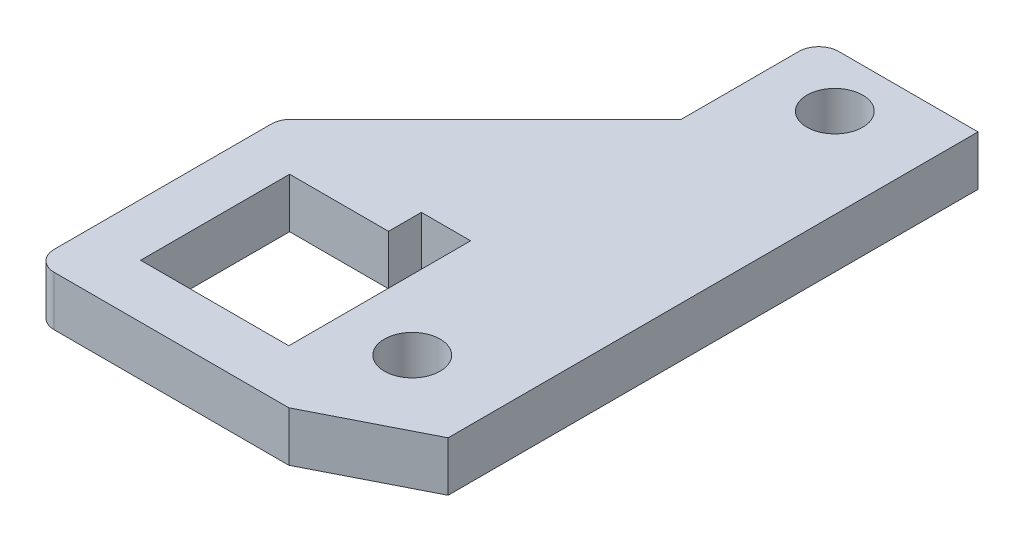
ISO-10303-21;
HEADER;
FILE_DESCRIPTION(('STEP AP214'),'2;1');
FILE_NAME('part.step','',(''),(''),'','','');
FILE_SCHEMA(('AUTOMOTIVE_DESIGN { 1 0 10303 214 1 1 1 1 }'));
ENDSEC;
DATA;
#1=APPLICATION_CONTEXT('core data for automotive mechanical design processes');
#2=APPLICATION_PROTOCOL_DEFINITION('international standard','automotive_design',2000,#1);
#3=PRODUCT_CONTEXT('',#1,'mechanical');
#4=PRODUCT('Part','Part','',(#3));
#5=PRODUCT_RELATED_PRODUCT_CATEGORY('part','',(#4));
#6=PRODUCT_DEFINITION_FORMATION('','',#4);
#7=PRODUCT_DEFINITION_CONTEXT('part definition',#1,'design');
#8=PRODUCT_DEFINITION('design','',#6,#7);
#9=PRODUCT_DEFINITION_SHAPE('','',#8);
#10=(LENGTH_UNIT() NAMED_UNIT(*) SI_UNIT(.MILLI.,.METRE.));
#11=(NAMED_UNIT(*) PLANE_ANGLE_UNIT() SI_UNIT($,.RADIAN.));
#12=(NAMED_UNIT(*) SI_UNIT($,.STERADIAN.) SOLID_ANGLE_UNIT());
#13=UNCERTAINTY_MEASURE_WITH_UNIT(LENGTH_MEASURE(1.E-05),#10,'distance_accuracy_value','');
#14=(GEOMETRIC_REPRESENTATION_CONTEXT(3) GLOBAL_UNCERTAINTY_ASSIGNED_CONTEXT((#13)) GLOBAL_UNIT_ASSIGNED_CONTEXT((#10,
#11,#12)) REPRESENTATION_CONTEXT('',''));
#15=CARTESIAN_POINT('',(0.,0.,0.));
#16=DIRECTION('',(0.,0.,1.));
#17=DIRECTION('',(1.,0.,0.));
#18=AXIS2_PLACEMENT_3D('',#15,#16,#17);
#19=CARTESIAN_POINT('',(1.27,3.175,-1.27));
#20=DIRECTION('',(0.,-1.,0.));
#21=DIRECTION('',(0.,0.,-1.));
#22=AXIS2_PLACEMENT_3D('',#19,#20,#21);
#23=CYLINDRICAL_SURFACE('',#22,1.27);
#24=CARTESIAN_POINT('',(1.27,0.,-1.27));
#25=DIRECTION('',(0.,-1.,0.));
#26=DIRECTION('',(0.,0.,-1.));
#27=AXIS2_PLACEMENT_3D('',#24,#25,#26);
#28=CIRCLE('',#27,1.27);
#29=CARTESIAN_POINT('',(1.27,0.,0.));
#30=VERTEX_POINT('',#29);
#31=CARTESIAN_POINT('',(0.,0.,-1.27));
#32=VERTEX_POINT('',#31);
#33=EDGE_CURVE('E194',#30,#32,#28,.T.);
#34=ORIENTED_EDGE('',*,*,#33,.F.);
#35=DIRECTION('',(0.,-1.,0.));
#36=VECTOR('',#35,1.);
#37=CARTESIAN_POINT('',(1.27,3.175,0.));
#38=LINE('',#37,#36);
#39=CARTESIAN_POINT('',(1.27,3.175,0.));
#40=VERTEX_POINT('',#39);
#41=EDGE_CURVE('E11',#40,#30,#38,.T.);
#42=ORIENTED_EDGE('',*,*,#41,.F.);
#43=CARTESIAN_POINT('',(1.27,3.175,-1.27));
#44=DIRECTION('',(0.,-1.,0.));
#45=DIRECTION('',(0.,0.,-1.));
#46=AXIS2_PLACEMENT_3D('',#43,#44,#45);
#47=CIRCLE('',#46,1.27);
#48=CARTESIAN_POINT('',(0.,3.175,-1.27));
#49=VERTEX_POINT('',#48);
#50=EDGE_CURVE('E202',#40,#49,#47,.T.);
#51=ORIENTED_EDGE('',*,*,#50,.T.);
#52=DIRECTION('',(0.,-1.,0.));
#53=VECTOR('',#52,1.);
#54=CARTESIAN_POINT('',(0.,3.175,-1.27));
#55=LINE('',#54,#53);
#56=EDGE_CURVE('E35',#49,#32,#55,.T.);
#57=ORIENTED_EDGE('',*,*,#56,.T.);
#58=EDGE_LOOP('',(#34,#42,#51,#57));
#59=FACE_BOUND('',#58,.T.);
#60=ADVANCED_FACE('F32',(#59),#23,.T.);
#61=CARTESIAN_POINT('',(16.2239556670893,3.175,0.));
#62=DIRECTION('',(0.,0.,1.));
#63=DIRECTION('',(1.,0.,0.));
#64=AXIS2_PLACEMENT_3D('',#61,#62,#63);
#65=PLANE('',#64);
#66=DIRECTION('',(-1.,0.,0.));
#67=VECTOR('',#66,1.);
#68=CARTESIAN_POINT('',(16.2239556670893,0.,0.));
#69=LINE('',#68,#67);
#70=CARTESIAN_POINT('',(16.2239556670893,0.,0.));
#71=VERTEX_POINT('',#70);
#72=EDGE_CURVE('E206',#71,#30,#69,.T.);
#73=ORIENTED_EDGE('',*,*,#72,.F.);
#74=DIRECTION('',(0.,-1.,0.));
#75=VECTOR('',#74,1.);
#76=CARTESIAN_POINT('',(16.2239556670893,3.175,0.));
#77=LINE('',#76,#75);
#78=CARTESIAN_POINT('',(16.2239556670893,3.175,0.));
#79=VERTEX_POINT('',#78);
#80=EDGE_CURVE('E40',#79,#71,#77,.T.);
#81=ORIENTED_EDGE('',*,*,#80,.F.);
#82=DIRECTION('',(-1.,0.,0.));
#83=VECTOR('',#82,1.);
#84=CARTESIAN_POINT('',(16.2239556670893,3.175,0.));
#85=LINE('',#84,#83);
#86=EDGE_CURVE('E230',#79,#40,#85,.T.);
#87=ORIENTED_EDGE('',*,*,#86,.T.);
#88=ORIENTED_EDGE('',*,*,#41,.T.);
#89=EDGE_LOOP('',(#73,#81,#87,#88));
#90=FACE_BOUND('',#89,.T.);
#91=ADVANCED_FACE('F287',(#90),#65,.T.);
#92=CARTESIAN_POINT('',(22.9633593823173,3.175,-3.42057377293219));
#93=DIRECTION('',(0.452590350451546,0.,0.891718551269483));
#94=DIRECTION('',(0.891718551269483,0.,-0.452590350451546));
#95=AXIS2_PLACEMENT_3D('',#92,#93,#94);
#96=PLANE('',#95);
#97=DIRECTION('',(-0.891718551269483,0.,0.452590350451546));
#98=VECTOR('',#97,1.);
#99=CARTESIAN_POINT('',(22.9633593823173,0.,-3.42057377293219));
#100=LINE('',#99,#98);
#101=CARTESIAN_POINT('',(22.9633593823173,0.,-3.42057377293219));
#102=VERTEX_POINT('',#101);
#103=EDGE_CURVE('E256',#102,#71,#100,.T.);
#104=ORIENTED_EDGE('',*,*,#103,.F.);
#105=DIRECTION('',(0.,-1.,0.));
#106=VECTOR('',#105,1.);
#107=CARTESIAN_POINT('',(22.9633593823173,3.175,-3.42057377293219));
#108=LINE('',#107,#106);
#109=CARTESIAN_POINT('',(22.9633593823173,3.175,-3.42057377293219));
#110=VERTEX_POINT('',#109);
#111=EDGE_CURVE('E262',#110,#102,#108,.T.);
#112=ORIENTED_EDGE('',*,*,#111,.F.);
#113=DIRECTION('',(-0.891718551269483,0.,0.452590350451546));
#114=VECTOR('',#113,1.);
#115=CARTESIAN_POINT('',(22.9633593823173,3.175,-3.42057377293219));
#116=LINE('',#115,#114);
#117=EDGE_CURVE('E227',#110,#79,#116,.T.);
#118=ORIENTED_EDGE('',*,*,#117,.T.);
#119=ORIENTED_EDGE('',*,*,#80,.T.);
#120=EDGE_LOOP('',(#104,#112,#118,#119));
#121=FACE_BOUND('',#120,.T.);
#122=ADVANCED_FACE('F314',(#121),#96,.T.);
#123=CARTESIAN_POINT('',(22.9633593823173,3.175,-37.2025926));
#124=DIRECTION('',(1.,0.,0.));
#125=DIRECTION('',(0.,0.,-1.));
#126=AXIS2_PLACEMENT_3D('',#123,#124,#125);
#127=PLANE('',#126);
#128=DIRECTION('',(0.,0.,1.));
#129=VECTOR('',#128,1.);
#130=CARTESIAN_POINT('',(22.9633593823173,0.,-37.2025926));
#131=LINE('',#130,#129);
#132=CARTESIAN_POINT('',(22.9633593823173,0.,-37.2025926));
#133=VERTEX_POINT('',#132);
#134=EDGE_CURVE('E253',#133,#102,#131,.T.);
#135=ORIENTED_EDGE('',*,*,#134,.F.);
#136=DIRECTION('',(0.,-1.,0.));
#137=VECTOR('',#136,1.);
#138=CARTESIAN_POINT('',(22.9633593823173,3.175,-37.2025926));
#139=LINE('',#138,#137);
#140=CARTESIAN_POINT('',(22.9633593823173,3.175,-37.2025926));
#141=VERTEX_POINT('',#140);
#142=EDGE_CURVE('E264',#141,#133,#139,.T.);
#143=ORIENTED_EDGE('',*,*,#142,.F.);
#144=DIRECTION('',(0.,0.,1.));
#145=VECTOR('',#144,1.);
#146=CARTESIAN_POINT('',(22.9633593823173,3.175,-37.2025926));
#147=LINE('',#146,#145);
#148=EDGE_CURVE('E224',#141,#110,#147,.T.);
#149=ORIENTED_EDGE('',*,*,#148,.T.);
#150=ORIENTED_EDGE('',*,*,#111,.T.);
#151=EDGE_LOOP('',(#135,#143,#149,#150));
#152=FACE_BOUND('',#151,.T.);
#153=ADVANCED_FACE('F312',(#152),#127,.T.);
#154=CARTESIAN_POINT('',(14.0812333823173,3.175,-37.2025926));
#155=DIRECTION('',(0.,0.,-1.));
#156=DIRECTION('',(-1.,0.,0.));
#157=AXIS2_PLACEMENT_3D('',#154,#155,#156);
#158=PLANE('',#157);
#159=DIRECTION('',(1.,0.,0.));
#160=VECTOR('',#159,1.);
#161=CARTESIAN_POINT('',(14.0812333823173,0.,-37.2025926));
#162=LINE('',#161,#160);
#163=CARTESIAN_POINT('',(14.0812333823173,0.,-37.2025926));
#164=VERTEX_POINT('',#163);
#165=EDGE_CURVE('E250',#164,#133,#162,.T.);
#166=ORIENTED_EDGE('',*,*,#165,.F.);
#167=DIRECTION('',(0.,-1.,0.));
#168=VECTOR('',#167,1.);
#169=CARTESIAN_POINT('',(14.0812333823173,3.175,-37.2025926));
#170=LINE('',#169,#168);
#171=CARTESIAN_POINT('',(14.0812333823173,3.175,-37.2025926));
#172=VERTEX_POINT('',#171);
#173=EDGE_CURVE('E266',#172,#164,#170,.T.);
#174=ORIENTED_EDGE('',*,*,#173,.F.);
#175=DIRECTION('',(1.,0.,0.));
#176=VECTOR('',#175,1.);
#177=CARTESIAN_POINT('',(14.0812333823173,3.175,-37.2025926));
#178=LINE('',#177,#176);
#179=EDGE_CURVE('E221',#172,#141,#178,.T.);
#180=ORIENTED_EDGE('',*,*,#179,.T.);
#181=ORIENTED_EDGE('',*,*,#142,.T.);
#182=EDGE_LOOP('',(#166,#174,#180,#181));
#183=FACE_BOUND('',#182,.T.);
#184=ADVANCED_FACE('F308',(#183),#158,.T.);
#185=CARTESIAN_POINT('',(14.0812333823173,3.175,-35.9325926));
#186=DIRECTION('',(0.,-1.,0.));
#187=DIRECTION('',(0.,0.,-1.));
#188=AXIS2_PLACEMENT_3D('',#185,#186,#187);
#189=CYLINDRICAL_SURFACE('',#188,1.27);
#190=CARTESIAN_POINT('',(14.0812333823173,0.,-35.9325926));
#191=DIRECTION('',(0.,-1.,0.));
#192=DIRECTION('',(0.,0.,-1.));
#193=AXIS2_PLACEMENT_3D('',#190,#191,#192);
#194=CIRCLE('',#193,1.27);
#195=CARTESIAN_POINT('',(12.8112333823173,0.,-35.9325926));
#196=VERTEX_POINT('',#195);
#197=EDGE_CURVE('E247',#196,#164,#194,.T.);
#198=ORIENTED_EDGE('',*,*,#197,.F.);
#199=DIRECTION('',(0.,-1.,0.));
#200=VECTOR('',#199,1.);
#201=CARTESIAN_POINT('',(12.8112333823173,3.175,-35.9325926));
#202=LINE('',#201,#200);
#203=CARTESIAN_POINT('',(12.8112333823173,3.175,-35.9325926));
#204=VERTEX_POINT('',#203);
#205=EDGE_CURVE('E268',#204,#196,#202,.T.);
#206=ORIENTED_EDGE('',*,*,#205,.F.);
#207=CARTESIAN_POINT('',(14.0812333823173,3.175,-35.9325926));
#208=DIRECTION('',(0.,-1.,0.));
#209=DIRECTION('',(0.,0.,-1.));
#210=AXIS2_PLACEMENT_3D('',#207,#208,#209);
#211=CIRCLE('',#210,1.27);
#212=EDGE_CURVE('E218',#204,#172,#211,.T.);
#213=ORIENTED_EDGE('',*,*,#212,.T.);
#214=ORIENTED_EDGE('',*,*,#173,.T.);
#215=EDGE_LOOP('',(#198,#206,#213,#214));
#216=FACE_BOUND('',#215,.T.);
#217=ADVANCED_FACE('F304',(#216),#189,.T.);
#218=CARTESIAN_POINT('',(12.8112333823173,3.175,-28.4334966));
#219=DIRECTION('',(-1.,0.,0.));
#220=DIRECTION('',(0.,0.,1.));
#221=AXIS2_PLACEMENT_3D('',#218,#219,#220);
#222=PLANE('',#221);
#223=DIRECTION('',(0.,0.,-1.));
#224=VECTOR('',#223,1.);
#225=CARTESIAN_POINT('',(12.8112333823173,0.,-28.4334966));
#226=LINE('',#225,#224);
#227=CARTESIAN_POINT('',(12.8112333823173,0.,-28.4334966));
#228=VERTEX_POINT('',#227);
#229=EDGE_CURVE('E244',#228,#196,#226,.T.);
#230=ORIENTED_EDGE('',*,*,#229,.F.);
#231=DIRECTION('',(0.,-1.,0.));
#232=VECTOR('',#231,1.);
#233=CARTESIAN_POINT('',(12.8112333823173,3.175,-28.4334966));
#234=LINE('',#233,#232);
#235=CARTESIAN_POINT('',(12.8112333823173,3.175,-28.4334966));
#236=VERTEX_POINT('',#235);
#237=EDGE_CURVE('E270',#236,#228,#234,.T.);
#238=ORIENTED_EDGE('',*,*,#237,.F.);
#239=DIRECTION('',(0.,0.,-1.));
#240=VECTOR('',#239,1.);
#241=CARTESIAN_POINT('',(12.8112333823173,3.175,-28.4334966));
#242=LINE('',#241,#240);
#243=EDGE_CURVE('E215',#236,#204,#242,.T.);
#244=ORIENTED_EDGE('',*,*,#243,.T.);
#245=ORIENTED_EDGE('',*,*,#205,.T.);
#246=EDGE_LOOP('',(#230,#238,#244,#245));
#247=FACE_BOUND('',#246,.T.);
#248=ADVANCED_FACE('F300',(#247),#222,.T.);
#249=CARTESIAN_POINT('',(0.371974387893079,3.175,-15.9942376055759));
#250=DIRECTION('',(-0.707106781186546,0.,-0.707106781186549));
#251=DIRECTION('',(-0.707106781186549,0.,0.707106781186546));
#252=AXIS2_PLACEMENT_3D('',#249,#250,#251);
#253=PLANE('',#252);
#254=DIRECTION('',(0.707106781186549,0.,-0.707106781186546));
#255=VECTOR('',#254,1.);
#256=CARTESIAN_POINT('',(0.371974387893079,0.,-15.9942376055759));
#257=LINE('',#256,#255);
#258=CARTESIAN_POINT('',(0.371974387893079,0.,-15.9942376055759));
#259=VERTEX_POINT('',#258);
#260=EDGE_CURVE('E241',#259,#228,#257,.T.);
#261=ORIENTED_EDGE('',*,*,#260,.F.);
#262=DIRECTION('',(0.,-1.,0.));
#263=VECTOR('',#262,1.);
#264=CARTESIAN_POINT('',(0.371974387893079,3.175,-15.9942376055759));
#265=LINE('',#264,#263);
#266=CARTESIAN_POINT('',(0.371974387893079,3.175,-15.9942376055759));
#267=VERTEX_POINT('',#266);
#268=EDGE_CURVE('E272',#267,#259,#265,.T.);
#269=ORIENTED_EDGE('',*,*,#268,.F.);
#270=DIRECTION('',(0.707106781186549,0.,-0.707106781186546));
#271=VECTOR('',#270,1.);
#272=CARTESIAN_POINT('',(0.371974387893079,3.175,-15.9942376055759));
#273=LINE('',#272,#271);
#274=EDGE_CURVE('E212',#267,#236,#273,.T.);
#275=ORIENTED_EDGE('',*,*,#274,.T.);
#276=ORIENTED_EDGE('',*,*,#237,.T.);
#277=EDGE_LOOP('',(#261,#269,#275,#276));
#278=FACE_BOUND('',#277,.T.);
#279=ADVANCED_FACE('F298',(#278),#253,.T.);
#280=CARTESIAN_POINT('',(1.26999999999999,3.175,-15.096211993469));
#281=DIRECTION('',(0.,-1.,0.));
#282=DIRECTION('',(0.,0.,-1.));
#283=AXIS2_PLACEMENT_3D('',#280,#281,#282);
#284=CYLINDRICAL_SURFACE('',#283,1.27);
#285=CARTESIAN_POINT('',(1.26999999999999,0.,-15.096211993469));
#286=DIRECTION('',(0.,-1.,0.));
#287=DIRECTION('',(0.,0.,-1.));
#288=AXIS2_PLACEMENT_3D('',#285,#286,#287);
#289=CIRCLE('',#288,1.27);
#290=CARTESIAN_POINT('',(0.,0.,-15.096211993469));
#291=VERTEX_POINT('',#290);
#292=EDGE_CURVE('E238',#291,#259,#289,.T.);
#293=ORIENTED_EDGE('',*,*,#292,.F.);
#294=DIRECTION('',(0.,-1.,0.));
#295=VECTOR('',#294,1.);
#296=CARTESIAN_POINT('',(0.,3.175,-15.096211993469));
#297=LINE('',#296,#295);
#298=CARTESIAN_POINT('',(0.,3.175,-15.096211993469));
#299=VERTEX_POINT('',#298);
#300=EDGE_CURVE('E273',#299,#291,#297,.T.);
#301=ORIENTED_EDGE('',*,*,#300,.F.);
#302=CARTESIAN_POINT('',(1.26999999999999,3.175,-15.096211993469));
#303=DIRECTION('',(0.,-1.,0.));
#304=DIRECTION('',(0.,0.,-1.));
#305=AXIS2_PLACEMENT_3D('',#302,#303,#304);
#306=CIRCLE('',#305,1.27);
#307=EDGE_CURVE('E209',#299,#267,#306,.T.);
#308=ORIENTED_EDGE('',*,*,#307,.T.);
#309=ORIENTED_EDGE('',*,*,#268,.T.);
#310=EDGE_LOOP('',(#293,#301,#308,#309));
#311=FACE_BOUND('',#310,.T.);
#312=ADVANCED_FACE('F294',(#311),#284,.T.);
#313=CARTESIAN_POINT('',(0.,3.175,-1.27));
#314=DIRECTION('',(-1.,0.,0.));
#315=DIRECTION('',(0.,0.,1.));
#316=AXIS2_PLACEMENT_3D('',#313,#314,#315);
#317=PLANE('',#316);
#318=DIRECTION('',(0.,0.,-1.));
#319=VECTOR('',#318,1.);
#320=CARTESIAN_POINT('',(0.,0.,-1.27));
#321=LINE('',#320,#319);
#322=EDGE_CURVE('E235',#32,#291,#321,.T.);
#323=ORIENTED_EDGE('',*,*,#322,.F.);
#324=ORIENTED_EDGE('',*,*,#56,.F.);
#325=DIRECTION('',(0.,0.,-1.));
#326=VECTOR('',#325,1.);
#327=CARTESIAN_POINT('',(0.,3.175,-1.27));
#328=LINE('',#327,#326);
#329=EDGE_CURVE('E205',#49,#299,#328,.T.);
#330=ORIENTED_EDGE('',*,*,#329,.T.);
#331=ORIENTED_EDGE('',*,*,#300,.T.);
#332=EDGE_LOOP('',(#323,#324,#330,#331));
#333=FACE_BOUND('',#332,.T.);
#334=ADVANCED_FACE('F281',(#333),#317,.T.);
#335=CARTESIAN_POINT('',(1.27,3.175,-1.27));
#336=DIRECTION('',(0.,-1.,0.));
#337=DIRECTION('',(0.,0.,-1.));
#338=AXIS2_PLACEMENT_3D('',#335,#336,#337);
#339=PLANE('',#338);
#340=CARTESIAN_POINT('',(17.2559793823173,3.175,-6.84044423679253));
#341=DIRECTION('',(0.,-1.,0.));
#342=DIRECTION('',(0.,0.,1.));
#343=AXIS2_PLACEMENT_3D('',#340,#341,#342);
#344=CIRCLE('',#343,1.778);
#345=CARTESIAN_POINT('',(17.2559793823173,3.175,-5.06244423679253));
#346=VERTEX_POINT('',#345);
#347=EDGE_CURVE('E487',#346,#346,#344,.T.);
#348=ORIENTED_EDGE('',*,*,#347,.T.);
#349=EDGE_LOOP('',(#348));
#350=FACE_BOUND('',#349,.T.);
#351=CARTESIAN_POINT('',(17.2559793823173,3.175,-33.7812126));
#352=DIRECTION('',(0.,-1.,0.));
#353=DIRECTION('',(0.,0.,1.));
#354=AXIS2_PLACEMENT_3D('',#351,#352,#353);
#355=CIRCLE('',#354,1.77800000000001);
#356=CARTESIAN_POINT('',(17.2559793823173,3.175,-32.0032126));
#357=VERTEX_POINT('',#356);
#358=EDGE_CURVE('E182',#357,#357,#355,.T.);
#359=ORIENTED_EDGE('',*,*,#358,.T.);
#360=EDGE_LOOP('',(#359));
#361=FACE_BOUND('',#360,.T.);
#362=DIRECTION('',(1.,0.,0.));
#363=VECTOR('',#362,1.);
#364=CARTESIAN_POINT('',(9.66215999999999,3.175,-12.92098));
#365=LINE('',#364,#363);
#366=CARTESIAN_POINT('',(3.35787999999999,3.175,-12.92098));
#367=VERTEX_POINT('',#366);
#368=CARTESIAN_POINT('',(9.66215999999999,3.175,-12.92098));
#369=VERTEX_POINT('',#368);
#370=EDGE_CURVE('E153',#367,#369,#365,.T.);
#371=ORIENTED_EDGE('',*,*,#370,.T.);
#372=DIRECTION('',(0.,0.,-1.));
#373=VECTOR('',#372,1.);
#374=CARTESIAN_POINT('',(9.66215999999999,3.175,-15.01648));
#375=LINE('',#374,#373);
#376=CARTESIAN_POINT('',(9.66215999999999,3.175,-15.01648));
#377=VERTEX_POINT('',#376);
#378=EDGE_CURVE('E147',#369,#377,#375,.T.);
#379=ORIENTED_EDGE('',*,*,#378,.T.);
#380=DIRECTION('',(1.,0.,0.));
#381=VECTOR('',#380,1.);
#382=CARTESIAN_POINT('',(12.80414,3.175,-15.01648));
#383=LINE('',#382,#381);
#384=CARTESIAN_POINT('',(12.80414,3.175,-15.01648));
#385=VERTEX_POINT('',#384);
#386=EDGE_CURVE('E156',#377,#385,#383,.T.);
#387=ORIENTED_EDGE('',*,*,#386,.T.);
#388=DIRECTION('',(0.,0.,1.));
#389=VECTOR('',#388,1.);
#390=CARTESIAN_POINT('',(12.80414,3.175,-3.42138));
#391=LINE('',#390,#389);
#392=CARTESIAN_POINT('',(12.80414,3.175,-3.42138));
#393=VERTEX_POINT('',#392);
#394=EDGE_CURVE('E48',#385,#393,#391,.T.);
#395=ORIENTED_EDGE('',*,*,#394,.T.);
#396=DIRECTION('',(-1.,0.,0.));
#397=VECTOR('',#396,1.);
#398=CARTESIAN_POINT('',(3.35787999999999,3.175,-3.42138));
#399=LINE('',#398,#397);
#400=CARTESIAN_POINT('',(3.35787999999999,3.175,-3.42138));
#401=VERTEX_POINT('',#400);
#402=EDGE_CURVE('E174',#393,#401,#399,.T.);
#403=ORIENTED_EDGE('',*,*,#402,.T.);
#404=DIRECTION('',(0.,0.,-1.));
#405=VECTOR('',#404,1.);
#406=CARTESIAN_POINT('',(3.35787999999999,3.175,-12.92098));
#407=LINE('',#406,#405);
#408=EDGE_CURVE('E177',#401,#367,#407,.T.);
#409=ORIENTED_EDGE('',*,*,#408,.T.);
#410=EDGE_LOOP('',(#371,#379,#387,#395,#403,#409));
#411=FACE_BOUND('',#410,.T.);
#412=ORIENTED_EDGE('',*,*,#50,.F.);
#413=ORIENTED_EDGE('',*,*,#86,.F.);
#414=ORIENTED_EDGE('',*,*,#117,.F.);
#415=ORIENTED_EDGE('',*,*,#148,.F.);
#416=ORIENTED_EDGE('',*,*,#179,.F.);
#417=ORIENTED_EDGE('',*,*,#212,.F.);
#418=ORIENTED_EDGE('',*,*,#243,.F.);
#419=ORIENTED_EDGE('',*,*,#274,.F.);
#420=ORIENTED_EDGE('',*,*,#307,.F.);
#421=ORIENTED_EDGE('',*,*,#329,.F.);
#422=EDGE_LOOP('',(#412,#413,#414,#415,#416,#417,#418,#419,#420,#421));
#423=FACE_BOUND('',#422,.T.);
#424=ADVANCED_FACE('F160',(#350,#361,#411,#423),#339,.F.);
#425=CARTESIAN_POINT('',(1.27,0.,-1.27));
#426=DIRECTION('',(0.,-1.,0.));
#427=DIRECTION('',(0.,0.,-1.));
#428=AXIS2_PLACEMENT_3D('',#425,#426,#427);
#429=PLANE('',#428);
#430=CARTESIAN_POINT('',(17.2559793823173,0.,-6.84044423679253));
#431=DIRECTION('',(0.,-1.,0.));
#432=DIRECTION('',(0.,0.,1.));
#433=AXIS2_PLACEMENT_3D('',#430,#431,#432);
#434=CIRCLE('',#433,1.778);
#435=CARTESIAN_POINT('',(17.2559793823173,0.,-5.06244423679253));
#436=VERTEX_POINT('',#435);
#437=EDGE_CURVE('E490',#436,#436,#434,.T.);
#438=ORIENTED_EDGE('',*,*,#437,.F.);
#439=EDGE_LOOP('',(#438));
#440=FACE_BOUND('',#439,.T.);
#441=CARTESIAN_POINT('',(17.2559793823173,0.,-33.7812126));
#442=DIRECTION('',(0.,-1.,0.));
#443=DIRECTION('',(0.,0.,1.));
#444=AXIS2_PLACEMENT_3D('',#441,#442,#443);
#445=CIRCLE('',#444,1.77800000000001);
#446=CARTESIAN_POINT('',(17.2559793823173,0.,-32.0032126));
#447=VERTEX_POINT('',#446);
#448=EDGE_CURVE('E170',#447,#447,#445,.T.);
#449=ORIENTED_EDGE('',*,*,#448,.F.);
#450=EDGE_LOOP('',(#449));
#451=FACE_BOUND('',#450,.T.);
#452=DIRECTION('',(0.,0.,-1.));
#453=VECTOR('',#452,1.);
#454=CARTESIAN_POINT('',(9.66215999999999,0.,-15.01648));
#455=LINE('',#454,#453);
#456=CARTESIAN_POINT('',(9.66215999999999,0.,-12.92098));
#457=VERTEX_POINT('',#456);
#458=CARTESIAN_POINT('',(9.66215999999999,0.,-15.01648));
#459=VERTEX_POINT('',#458);
#460=EDGE_CURVE('E56',#457,#459,#455,.T.);
#461=ORIENTED_EDGE('',*,*,#460,.F.);
#462=DIRECTION('',(1.,0.,0.));
#463=VECTOR('',#462,1.);
#464=CARTESIAN_POINT('',(9.66215999999999,0.,-12.92098));
#465=LINE('',#464,#463);
#466=CARTESIAN_POINT('',(3.35787999999999,0.,-12.92098));
#467=VERTEX_POINT('',#466);
#468=EDGE_CURVE('E164',#467,#457,#465,.T.);
#469=ORIENTED_EDGE('',*,*,#468,.F.);
#470=DIRECTION('',(0.,0.,-1.));
#471=VECTOR('',#470,1.);
#472=CARTESIAN_POINT('',(3.35787999999999,0.,-12.92098));
#473=LINE('',#472,#471);
#474=CARTESIAN_POINT('',(3.35787999999999,0.,-3.42138));
#475=VERTEX_POINT('',#474);
#476=EDGE_CURVE('E167',#475,#467,#473,.T.);
#477=ORIENTED_EDGE('',*,*,#476,.F.);
#478=DIRECTION('',(-1.,0.,0.));
#479=VECTOR('',#478,1.);
#480=CARTESIAN_POINT('',(3.35787999999999,0.,-3.42138));
#481=LINE('',#480,#479);
#482=CARTESIAN_POINT('',(12.80414,0.,-3.42138));
#483=VERTEX_POINT('',#482);
#484=EDGE_CURVE('E187',#483,#475,#481,.T.);
#485=ORIENTED_EDGE('',*,*,#484,.F.);
#486=DIRECTION('',(0.,0.,1.));
#487=VECTOR('',#486,1.);
#488=CARTESIAN_POINT('',(12.80414,0.,-3.42138));
#489=LINE('',#488,#487);
#490=CARTESIAN_POINT('',(12.80414,0.,-15.01648));
#491=VERTEX_POINT('',#490);
#492=EDGE_CURVE('E184',#491,#483,#489,.T.);
#493=ORIENTED_EDGE('',*,*,#492,.F.);
#494=DIRECTION('',(1.,0.,0.));
#495=VECTOR('',#494,1.);
#496=CARTESIAN_POINT('',(12.80414,0.,-15.01648));
#497=LINE('',#496,#495);
#498=EDGE_CURVE('E181',#459,#491,#497,.T.);
#499=ORIENTED_EDGE('',*,*,#498,.F.);
#500=EDGE_LOOP('',(#461,#469,#477,#485,#493,#499));
#501=FACE_BOUND('',#500,.T.);
#502=ORIENTED_EDGE('',*,*,#33,.T.);
#503=ORIENTED_EDGE('',*,*,#322,.T.);
#504=ORIENTED_EDGE('',*,*,#292,.T.);
#505=ORIENTED_EDGE('',*,*,#260,.T.);
#506=ORIENTED_EDGE('',*,*,#229,.T.);
#507=ORIENTED_EDGE('',*,*,#197,.T.);
#508=ORIENTED_EDGE('',*,*,#165,.T.);
#509=ORIENTED_EDGE('',*,*,#134,.T.);
#510=ORIENTED_EDGE('',*,*,#103,.T.);
#511=ORIENTED_EDGE('',*,*,#72,.T.);
#512=EDGE_LOOP('',(#502,#503,#504,#505,#506,#507,#508,#509,#510,#511));
#513=FACE_BOUND('',#512,.T.);
#514=ADVANCED_FACE('F283',(#440,#451,#501,#513),#429,.T.);
#515=CARTESIAN_POINT('',(9.66215999999999,3.175,-15.01648));
#516=DIRECTION('',(-1.,0.,0.));
#517=DIRECTION('',(0.,0.,1.));
#518=AXIS2_PLACEMENT_3D('',#515,#516,#517);
#519=PLANE('',#518);
#520=ORIENTED_EDGE('',*,*,#460,.T.);
#521=DIRECTION('',(0.,-1.,0.));
#522=VECTOR('',#521,1.);
#523=CARTESIAN_POINT('',(9.66215999999999,3.175,-15.01648));
#524=LINE('',#523,#522);
#525=EDGE_CURVE('E143',#377,#459,#524,.T.);
#526=ORIENTED_EDGE('',*,*,#525,.F.);
#527=ORIENTED_EDGE('',*,*,#378,.F.);
#528=DIRECTION('',(0.,-1.,0.));
#529=VECTOR('',#528,1.);
#530=CARTESIAN_POINT('',(9.66215999999999,3.175,-12.92098));
#531=LINE('',#530,#529);
#532=EDGE_CURVE('E192',#369,#457,#531,.T.);
#533=ORIENTED_EDGE('',*,*,#532,.T.);
#534=EDGE_LOOP('',(#520,#526,#527,#533));
#535=FACE_BOUND('',#534,.T.);
#536=ADVANCED_FACE('F145',(#535),#519,.F.);
#537=CARTESIAN_POINT('',(9.66215999999999,3.175,-12.92098));
#538=DIRECTION('',(0.,0.,-1.));
#539=DIRECTION('',(-1.,0.,0.));
#540=AXIS2_PLACEMENT_3D('',#537,#538,#539);
#541=PLANE('',#540);
#542=ORIENTED_EDGE('',*,*,#468,.T.);
#543=ORIENTED_EDGE('',*,*,#532,.F.);
#544=ORIENTED_EDGE('',*,*,#370,.F.);
#545=DIRECTION('',(0.,-1.,0.));
#546=VECTOR('',#545,1.);
#547=CARTESIAN_POINT('',(3.35787999999999,3.175,-12.92098));
#548=LINE('',#547,#546);
#549=EDGE_CURVE('E195',#367,#467,#548,.T.);
#550=ORIENTED_EDGE('',*,*,#549,.T.);
#551=EDGE_LOOP('',(#542,#543,#544,#550));
#552=FACE_BOUND('',#551,.T.);
#553=ADVANCED_FACE('F414',(#552),#541,.F.);
#554=CARTESIAN_POINT('',(3.35787999999999,3.175,-12.92098));
#555=DIRECTION('',(-1.,0.,0.));
#556=DIRECTION('',(0.,0.,1.));
#557=AXIS2_PLACEMENT_3D('',#554,#555,#556);
#558=PLANE('',#557);
#559=ORIENTED_EDGE('',*,*,#476,.T.);
#560=ORIENTED_EDGE('',*,*,#549,.F.);
#561=ORIENTED_EDGE('',*,*,#408,.F.);
#562=DIRECTION('',(0.,-1.,0.));
#563=VECTOR('',#562,1.);
#564=CARTESIAN_POINT('',(3.35787999999999,3.175,-3.42138));
#565=LINE('',#564,#563);
#566=EDGE_CURVE('E197',#401,#475,#565,.T.);
#567=ORIENTED_EDGE('',*,*,#566,.T.);
#568=EDGE_LOOP('',(#559,#560,#561,#567));
#569=FACE_BOUND('',#568,.T.);
#570=ADVANCED_FACE('F423',(#569),#558,.F.);
#571=CARTESIAN_POINT('',(3.35787999999999,3.175,-3.42138));
#572=DIRECTION('',(0.,0.,1.));
#573=DIRECTION('',(1.,0.,0.));
#574=AXIS2_PLACEMENT_3D('',#571,#572,#573);
#575=PLANE('',#574);
#576=ORIENTED_EDGE('',*,*,#484,.T.);
#577=ORIENTED_EDGE('',*,*,#566,.F.);
#578=ORIENTED_EDGE('',*,*,#402,.F.);
#579=DIRECTION('',(0.,-1.,0.));
#580=VECTOR('',#579,1.);
#581=CARTESIAN_POINT('',(12.80414,3.175,-3.42138));
#582=LINE('',#581,#580);
#583=EDGE_CURVE('E199',#393,#483,#582,.T.);
#584=ORIENTED_EDGE('',*,*,#583,.T.);
#585=EDGE_LOOP('',(#576,#577,#578,#584));
#586=FACE_BOUND('',#585,.T.);
#587=ADVANCED_FACE('F433',(#586),#575,.F.);
#588=CARTESIAN_POINT('',(12.80414,3.175,-3.42138));
#589=DIRECTION('',(1.,0.,0.));
#590=DIRECTION('',(0.,0.,-1.));
#591=AXIS2_PLACEMENT_3D('',#588,#589,#590);
#592=PLANE('',#591);
#593=ORIENTED_EDGE('',*,*,#492,.T.);
#594=ORIENTED_EDGE('',*,*,#583,.F.);
#595=ORIENTED_EDGE('',*,*,#394,.F.);
#596=DIRECTION('',(0.,-1.,0.));
#597=VECTOR('',#596,1.);
#598=CARTESIAN_POINT('',(12.80414,3.175,-15.01648));
#599=LINE('',#598,#597);
#600=EDGE_CURVE('E152',#385,#491,#599,.T.);
#601=ORIENTED_EDGE('',*,*,#600,.T.);
#602=EDGE_LOOP('',(#593,#594,#595,#601));
#603=FACE_BOUND('',#602,.T.);
#604=ADVANCED_FACE('F443',(#603),#592,.F.);
#605=CARTESIAN_POINT('',(12.80414,3.175,-15.01648));
#606=DIRECTION('',(0.,0.,-1.));
#607=DIRECTION('',(-1.,0.,0.));
#608=AXIS2_PLACEMENT_3D('',#605,#606,#607);
#609=PLANE('',#608);
#610=ORIENTED_EDGE('',*,*,#498,.T.);
#611=ORIENTED_EDGE('',*,*,#600,.F.);
#612=ORIENTED_EDGE('',*,*,#386,.F.);
#613=ORIENTED_EDGE('',*,*,#525,.T.);
#614=EDGE_LOOP('',(#610,#611,#612,#613));
#615=FACE_BOUND('',#614,.T.);
#616=ADVANCED_FACE('F157',(#615),#609,.F.);
#617=CARTESIAN_POINT('',(17.2559793823173,3.175,-33.7812126));
#618=DIRECTION('',(0.,-1.,0.));
#619=DIRECTION('',(0.,0.,-1.));
#620=AXIS2_PLACEMENT_3D('',#617,#618,#619);
#621=CYLINDRICAL_SURFACE('',#620,1.77800000000001);
#622=ORIENTED_EDGE('',*,*,#358,.F.);
#623=EDGE_LOOP('',(#622));
#624=FACE_BOUND('',#623,.T.);
#625=ORIENTED_EDGE('',*,*,#448,.T.);
#626=EDGE_LOOP('',(#625));
#627=FACE_BOUND('',#626,.T.);
#628=ADVANCED_FACE('F461',(#624,#627),#621,.F.);
#629=CARTESIAN_POINT('',(17.2559793823173,3.175,-6.84044423679253));
#630=DIRECTION('',(0.,-1.,0.));
#631=DIRECTION('',(0.,0.,-1.));
#632=AXIS2_PLACEMENT_3D('',#629,#630,#631);
#633=CYLINDRICAL_SURFACE('',#632,1.778);
#634=ORIENTED_EDGE('',*,*,#347,.F.);
#635=EDGE_LOOP('',(#634));
#636=FACE_BOUND('',#635,.T.);
#637=ORIENTED_EDGE('',*,*,#437,.T.);
#638=EDGE_LOOP('',(#637));
#639=FACE_BOUND('',#638,.T.);
#640=ADVANCED_FACE('F470',(#636,#639),#633,.F.);
#641=CLOSED_SHELL('',(#60,#91,#122,#153,#184,#217,#248,#279,#312,#334,#424,#514,#536,#553,#570,
#587,#604,#616,#628,#640));
#642=MANIFOLD_SOLID_BREP('B2',#641);
#643=ADVANCED_BREP_SHAPE_REPRESENTATION('',(#18,#642),#14);
#644=SHAPE_DEFINITION_REPRESENTATION(#9,#643);
ENDSEC;
END-ISO-10303-21;
